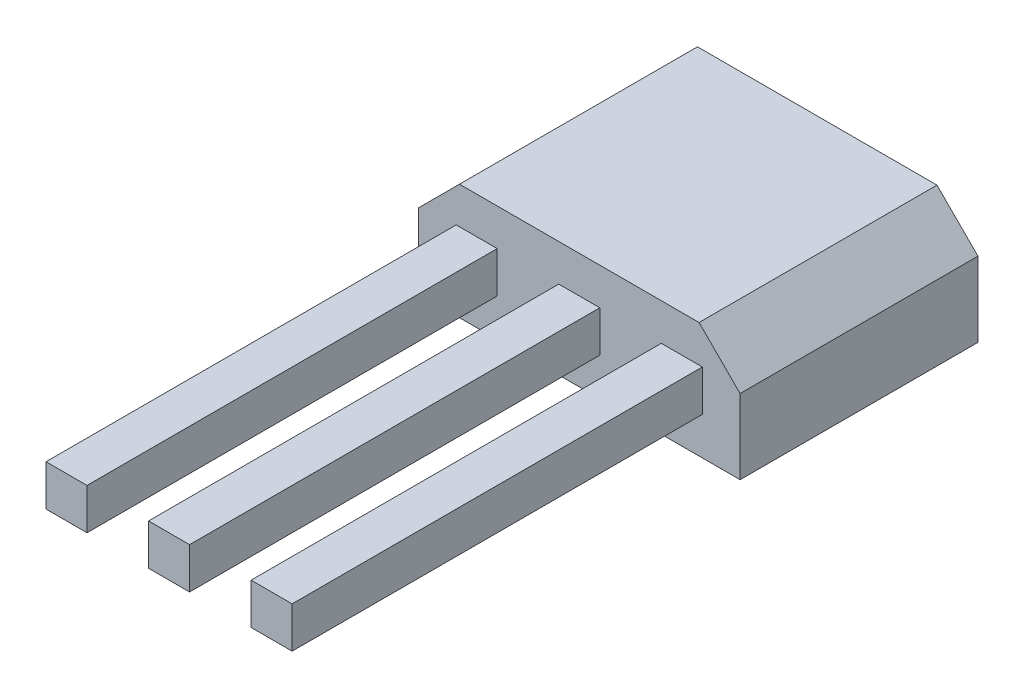
ISO-10303-21;
HEADER;
FILE_DESCRIPTION(('STEP AP214'),'2;1');
FILE_NAME('part.step','',(''),(''),'','','');
FILE_SCHEMA(('AUTOMOTIVE_DESIGN { 1 0 10303 214 1 1 1 1 }'));
ENDSEC;
DATA;
#1=APPLICATION_CONTEXT('core data for automotive mechanical design processes');
#2=APPLICATION_PROTOCOL_DEFINITION('international standard','automotive_design',2000,#1);
#3=PRODUCT_CONTEXT('',#1,'mechanical');
#4=PRODUCT('Part','Part','',(#3));
#5=PRODUCT_RELATED_PRODUCT_CATEGORY('part','',(#4));
#6=PRODUCT_DEFINITION_FORMATION('','',#4);
#7=PRODUCT_DEFINITION_CONTEXT('part definition',#1,'design');
#8=PRODUCT_DEFINITION('design','',#6,#7);
#9=PRODUCT_DEFINITION_SHAPE('','',#8);
#10=(LENGTH_UNIT() NAMED_UNIT(*) SI_UNIT(.MILLI.,.METRE.));
#11=(NAMED_UNIT(*) PLANE_ANGLE_UNIT() SI_UNIT($,.RADIAN.));
#12=(NAMED_UNIT(*) SI_UNIT($,.STERADIAN.) SOLID_ANGLE_UNIT());
#13=UNCERTAINTY_MEASURE_WITH_UNIT(LENGTH_MEASURE(1.E-05),#10,'distance_accuracy_value','');
#14=(GEOMETRIC_REPRESENTATION_CONTEXT(3) GLOBAL_UNCERTAINTY_ASSIGNED_CONTEXT((#13)) GLOBAL_UNIT_ASSIGNED_CONTEXT((#10,
#11,#12)) REPRESENTATION_CONTEXT('',''));
#15=CARTESIAN_POINT('',(0.,0.,0.));
#16=DIRECTION('',(0.,0.,1.));
#17=DIRECTION('',(1.,0.,0.));
#18=AXIS2_PLACEMENT_3D('',#15,#16,#17);
#19=CARTESIAN_POINT('',(0.,1.41,0.));
#20=DIRECTION('',(0.,0.,-1.));
#21=DIRECTION('',(-1.,0.,0.));
#22=AXIS2_PLACEMENT_3D('',#19,#20,#21);
#23=PLANE('',#22);
#24=DIRECTION('',(0.,-1.,0.));
#25=VECTOR('',#24,1.);
#26=CARTESIAN_POINT('',(1.71,0.96,0.));
#27=LINE('',#26,#25);
#28=CARTESIAN_POINT('',(1.71,0.96,0.));
#29=VERTEX_POINT('',#28);
#30=CARTESIAN_POINT('',(1.71,0.46,0.));
#31=VERTEX_POINT('',#30);
#32=EDGE_CURVE('E181',#29,#31,#27,.T.);
#33=ORIENTED_EDGE('',*,*,#32,.F.);
#34=DIRECTION('',(-1.,0.,0.));
#35=VECTOR('',#34,1.);
#36=CARTESIAN_POINT('',(1.71,0.96,0.));
#37=LINE('',#36,#35);
#38=CARTESIAN_POINT('',(2.21,0.96,0.));
#39=VERTEX_POINT('',#38);
#40=EDGE_CURVE('E194',#39,#29,#37,.T.);
#41=ORIENTED_EDGE('',*,*,#40,.F.);
#42=DIRECTION('',(0.,1.,0.));
#43=VECTOR('',#42,1.);
#44=CARTESIAN_POINT('',(2.21,0.96,0.));
#45=LINE('',#44,#43);
#46=CARTESIAN_POINT('',(2.21,0.46,0.));
#47=VERTEX_POINT('',#46);
#48=EDGE_CURVE('E203',#47,#39,#45,.T.);
#49=ORIENTED_EDGE('',*,*,#48,.F.);
#50=DIRECTION('',(1.,0.,0.));
#51=VECTOR('',#50,1.);
#52=CARTESIAN_POINT('',(1.71,0.46,0.));
#53=LINE('',#52,#51);
#54=EDGE_CURVE('E184',#31,#47,#53,.T.);
#55=ORIENTED_EDGE('',*,*,#54,.F.);
#56=EDGE_LOOP('',(#33,#41,#49,#55));
#57=FACE_BOUND('',#56,.T.);
#58=DIRECTION('',(1.,0.,0.));
#59=VECTOR('',#58,1.);
#60=CARTESIAN_POINT('',(0.,1.41,0.));
#61=LINE('',#60,#59);
#62=CARTESIAN_POINT('',(0.5,1.41,0.));
#63=VERTEX_POINT('',#62);
#64=CARTESIAN_POINT('',(3.42,1.41,0.));
#65=VERTEX_POINT('',#64);
#66=EDGE_CURVE('E253',#63,#65,#61,.T.);
#67=ORIENTED_EDGE('',*,*,#66,.F.);
#68=DIRECTION('',(0.707106781186547,0.707106781186549,0.));
#69=VECTOR('',#68,1.);
#70=CARTESIAN_POINT('',(0.5,1.41,0.));
#71=LINE('',#70,#69);
#72=CARTESIAN_POINT('',(0.,0.909999999999998,0.));
#73=VERTEX_POINT('',#72);
#74=EDGE_CURVE('E286',#63,#73,#71,.F.);
#75=ORIENTED_EDGE('',*,*,#74,.T.);
#76=DIRECTION('',(0.,-1.,0.));
#77=VECTOR('',#76,1.);
#78=CARTESIAN_POINT('',(0.,1.41,0.));
#79=LINE('',#78,#77);
#80=CARTESIAN_POINT('',(0.,0.,0.));
#81=VERTEX_POINT('',#80);
#82=EDGE_CURVE('E276',#73,#81,#79,.T.);
#83=ORIENTED_EDGE('',*,*,#82,.T.);
#84=DIRECTION('',(1.,0.,0.));
#85=VECTOR('',#84,1.);
#86=CARTESIAN_POINT('',(0.,0.,0.));
#87=LINE('',#86,#85);
#88=CARTESIAN_POINT('',(3.92,0.,0.));
#89=VERTEX_POINT('',#88);
#90=EDGE_CURVE('E263',#81,#89,#87,.T.);
#91=ORIENTED_EDGE('',*,*,#90,.T.);
#92=DIRECTION('',(0.,-1.,0.));
#93=VECTOR('',#92,1.);
#94=CARTESIAN_POINT('',(3.92,1.41,0.));
#95=LINE('',#94,#93);
#96=CARTESIAN_POINT('',(3.92,0.909999999999999,0.));
#97=VERTEX_POINT('',#96);
#98=EDGE_CURVE('E274',#97,#89,#95,.T.);
#99=ORIENTED_EDGE('',*,*,#98,.F.);
#100=DIRECTION('',(0.707106781186546,-0.707106781186549,0.));
#101=VECTOR('',#100,1.);
#102=CARTESIAN_POINT('',(3.42,1.41,0.));
#103=LINE('',#102,#101);
#104=EDGE_CURVE('E284',#97,#65,#103,.F.);
#105=ORIENTED_EDGE('',*,*,#104,.T.);
#106=EDGE_LOOP('',(#67,#75,#83,#91,#99,#105));
#107=FACE_BOUND('',#106,.T.);
#108=DIRECTION('',(0.,-1.,0.));
#109=VECTOR('',#108,1.);
#110=CARTESIAN_POINT('',(0.46,0.96,0.));
#111=LINE('',#110,#109);
#112=CARTESIAN_POINT('',(0.46,0.96,0.));
#113=VERTEX_POINT('',#112);
#114=CARTESIAN_POINT('',(0.46,0.46,0.));
#115=VERTEX_POINT('',#114);
#116=EDGE_CURVE('E219',#113,#115,#111,.T.);
#117=ORIENTED_EDGE('',*,*,#116,.F.);
#118=DIRECTION('',(-1.,0.,0.));
#119=VECTOR('',#118,1.);
#120=CARTESIAN_POINT('',(0.46,0.96,0.));
#121=LINE('',#120,#119);
#122=CARTESIAN_POINT('',(0.96,0.96,0.));
#123=VERTEX_POINT('',#122);
#124=EDGE_CURVE('E224',#123,#113,#121,.T.);
#125=ORIENTED_EDGE('',*,*,#124,.F.);
#126=DIRECTION('',(0.,1.,0.));
#127=VECTOR('',#126,1.);
#128=CARTESIAN_POINT('',(0.96,0.96,0.));
#129=LINE('',#128,#127);
#130=CARTESIAN_POINT('',(0.96,0.46,0.));
#131=VERTEX_POINT('',#130);
#132=EDGE_CURVE('E236',#131,#123,#129,.T.);
#133=ORIENTED_EDGE('',*,*,#132,.F.);
#134=DIRECTION('',(1.,0.,0.));
#135=VECTOR('',#134,1.);
#136=CARTESIAN_POINT('',(0.46,0.46,0.));
#137=LINE('',#136,#135);
#138=EDGE_CURVE('E233',#115,#131,#137,.T.);
#139=ORIENTED_EDGE('',*,*,#138,.F.);
#140=EDGE_LOOP('',(#117,#125,#133,#139));
#141=FACE_BOUND('',#140,.T.);
#142=DIRECTION('',(0.,-1.,0.));
#143=VECTOR('',#142,1.);
#144=CARTESIAN_POINT('',(2.96,0.960000000000002,0.));
#145=LINE('',#144,#143);
#146=CARTESIAN_POINT('',(2.96,0.960000000000002,0.));
#147=VERTEX_POINT('',#146);
#148=CARTESIAN_POINT('',(2.96,0.460000000000002,0.));
#149=VERTEX_POINT('',#148);
#150=EDGE_CURVE('E180',#147,#149,#145,.T.);
#151=ORIENTED_EDGE('',*,*,#150,.F.);
#152=DIRECTION('',(-1.,0.,0.));
#153=VECTOR('',#152,1.);
#154=CARTESIAN_POINT('',(2.96,0.960000000000002,0.));
#155=LINE('',#154,#153);
#156=CARTESIAN_POINT('',(3.46,0.960000000000002,0.));
#157=VERTEX_POINT('',#156);
#158=EDGE_CURVE('E177',#157,#147,#155,.T.);
#159=ORIENTED_EDGE('',*,*,#158,.F.);
#160=DIRECTION('',(0.,1.,0.));
#161=VECTOR('',#160,1.);
#162=CARTESIAN_POINT('',(3.46,0.960000000000002,0.));
#163=LINE('',#162,#161);
#164=CARTESIAN_POINT('',(3.46,0.460000000000002,0.));
#165=VERTEX_POINT('',#164);
#166=EDGE_CURVE('E56',#165,#157,#163,.T.);
#167=ORIENTED_EDGE('',*,*,#166,.F.);
#168=DIRECTION('',(1.,0.,0.));
#169=VECTOR('',#168,1.);
#170=CARTESIAN_POINT('',(2.96,0.460000000000002,0.));
#171=LINE('',#170,#169);
#172=EDGE_CURVE('E51',#149,#165,#171,.T.);
#173=ORIENTED_EDGE('',*,*,#172,.F.);
#174=EDGE_LOOP('',(#151,#159,#167,#173));
#175=FACE_BOUND('',#174,.T.);
#176=ADVANCED_FACE('F35',(#57,#107,#141,#175),#23,.F.);
#177=CARTESIAN_POINT('',(0.,1.41,0.));
#178=DIRECTION('',(1.,0.,0.));
#179=DIRECTION('',(0.,0.,-1.));
#180=AXIS2_PLACEMENT_3D('',#177,#178,#179);
#181=PLANE('',#180);
#182=ORIENTED_EDGE('',*,*,#82,.F.);
#183=DIRECTION('',(0.,0.,-1.));
#184=VECTOR('',#183,1.);
#185=CARTESIAN_POINT('',(0.,0.909999999999998,0.));
#186=LINE('',#185,#184);
#187=CARTESIAN_POINT('',(0.,0.909999999999998,-2.9));
#188=VERTEX_POINT('',#187);
#189=EDGE_CURVE('E288',#73,#188,#186,.T.);
#190=ORIENTED_EDGE('',*,*,#189,.T.);
#191=DIRECTION('',(0.,-1.,0.));
#192=VECTOR('',#191,1.);
#193=CARTESIAN_POINT('',(0.,1.41,-2.9));
#194=LINE('',#193,#192);
#195=CARTESIAN_POINT('',(0.,0.,-2.9));
#196=VERTEX_POINT('',#195);
#197=EDGE_CURVE('E260',#188,#196,#194,.T.);
#198=ORIENTED_EDGE('',*,*,#197,.T.);
#199=DIRECTION('',(0.,0.,1.));
#200=VECTOR('',#199,1.);
#201=CARTESIAN_POINT('',(0.,0.,0.));
#202=LINE('',#201,#200);
#203=EDGE_CURVE('E252',#196,#81,#202,.T.);
#204=ORIENTED_EDGE('',*,*,#203,.T.);
#205=EDGE_LOOP('',(#182,#190,#198,#204));
#206=FACE_BOUND('',#205,.T.);
#207=ADVANCED_FACE('F309',(#206),#181,.F.);
#208=CARTESIAN_POINT('',(3.92,1.41,0.));
#209=DIRECTION('',(-1.,0.,0.));
#210=DIRECTION('',(0.,0.,1.));
#211=AXIS2_PLACEMENT_3D('',#208,#209,#210);
#212=PLANE('',#211);
#213=DIRECTION('',(0.,-1.,0.));
#214=VECTOR('',#213,1.);
#215=CARTESIAN_POINT('',(3.92,1.41,-2.9));
#216=LINE('',#215,#214);
#217=CARTESIAN_POINT('',(3.92,0.909999999999999,-2.9));
#218=VERTEX_POINT('',#217);
#219=CARTESIAN_POINT('',(3.92,0.,-2.9));
#220=VERTEX_POINT('',#219);
#221=EDGE_CURVE('E272',#218,#220,#216,.T.);
#222=ORIENTED_EDGE('',*,*,#221,.F.);
#223=DIRECTION('',(0.,0.,1.));
#224=VECTOR('',#223,1.);
#225=CARTESIAN_POINT('',(3.92,0.909999999999999,0.));
#226=LINE('',#225,#224);
#227=EDGE_CURVE('E11',#218,#97,#226,.T.);
#228=ORIENTED_EDGE('',*,*,#227,.T.);
#229=ORIENTED_EDGE('',*,*,#98,.T.);
#230=DIRECTION('',(0.,0.,-1.));
#231=VECTOR('',#230,1.);
#232=CARTESIAN_POINT('',(3.92,0.,0.));
#233=LINE('',#232,#231);
#234=EDGE_CURVE('E266',#89,#220,#233,.T.);
#235=ORIENTED_EDGE('',*,*,#234,.T.);
#236=EDGE_LOOP('',(#222,#228,#229,#235));
#237=FACE_BOUND('',#236,.T.);
#238=ADVANCED_FACE('F321',(#237),#212,.F.);
#239=CARTESIAN_POINT('',(0.,1.41,-2.9));
#240=DIRECTION('',(0.,0.,1.));
#241=DIRECTION('',(1.,0.,0.));
#242=AXIS2_PLACEMENT_3D('',#239,#240,#241);
#243=PLANE('',#242);
#244=ORIENTED_EDGE('',*,*,#197,.F.);
#245=DIRECTION('',(-0.707106781186547,-0.707106781186549,0.));
#246=VECTOR('',#245,1.);
#247=CARTESIAN_POINT('',(0.5,1.41,-2.9));
#248=LINE('',#247,#246);
#249=CARTESIAN_POINT('',(0.5,1.41,-2.9));
#250=VERTEX_POINT('',#249);
#251=EDGE_CURVE('E44',#188,#250,#248,.F.);
#252=ORIENTED_EDGE('',*,*,#251,.T.);
#253=DIRECTION('',(-1.,0.,0.));
#254=VECTOR('',#253,1.);
#255=CARTESIAN_POINT('',(0.,1.41,-2.9));
#256=LINE('',#255,#254);
#257=CARTESIAN_POINT('',(3.42,1.41,-2.9));
#258=VERTEX_POINT('',#257);
#259=EDGE_CURVE('E256',#258,#250,#256,.T.);
#260=ORIENTED_EDGE('',*,*,#259,.F.);
#261=DIRECTION('',(-0.707106781186546,0.707106781186549,0.));
#262=VECTOR('',#261,1.);
#263=CARTESIAN_POINT('',(3.42,1.41,-2.9));
#264=LINE('',#263,#262);
#265=EDGE_CURVE('E290',#258,#218,#264,.F.);
#266=ORIENTED_EDGE('',*,*,#265,.T.);
#267=ORIENTED_EDGE('',*,*,#221,.T.);
#268=DIRECTION('',(-1.,0.,0.));
#269=VECTOR('',#268,1.);
#270=CARTESIAN_POINT('',(0.,0.,-2.9));
#271=LINE('',#270,#269);
#272=EDGE_CURVE('E257',#220,#196,#271,.T.);
#273=ORIENTED_EDGE('',*,*,#272,.T.);
#274=EDGE_LOOP('',(#244,#252,#260,#266,#267,#273));
#275=FACE_BOUND('',#274,.T.);
#276=ADVANCED_FACE('F295',(#275),#243,.F.);
#277=CARTESIAN_POINT('',(0.,1.41,0.));
#278=DIRECTION('',(0.,-1.,0.));
#279=DIRECTION('',(0.,0.,-1.));
#280=AXIS2_PLACEMENT_3D('',#277,#278,#279);
#281=PLANE('',#280);
#282=ORIENTED_EDGE('',*,*,#259,.T.);
#283=DIRECTION('',(0.,0.,1.));
#284=VECTOR('',#283,1.);
#285=CARTESIAN_POINT('',(0.5,1.41,0.));
#286=LINE('',#285,#284);
#287=EDGE_CURVE('E281',#250,#63,#286,.T.);
#288=ORIENTED_EDGE('',*,*,#287,.T.);
#289=ORIENTED_EDGE('',*,*,#66,.T.);
#290=DIRECTION('',(0.,0.,-1.));
#291=VECTOR('',#290,1.);
#292=CARTESIAN_POINT('',(3.42,1.41,0.));
#293=LINE('',#292,#291);
#294=EDGE_CURVE('E278',#65,#258,#293,.T.);
#295=ORIENTED_EDGE('',*,*,#294,.T.);
#296=EDGE_LOOP('',(#282,#288,#289,#295));
#297=FACE_BOUND('',#296,.T.);
#298=ADVANCED_FACE('F300',(#297),#281,.F.);
#299=CARTESIAN_POINT('',(0.,0.,0.));
#300=DIRECTION('',(0.,-1.,0.));
#301=DIRECTION('',(0.,0.,-1.));
#302=AXIS2_PLACEMENT_3D('',#299,#300,#301);
#303=PLANE('',#302);
#304=ORIENTED_EDGE('',*,*,#203,.F.);
#305=ORIENTED_EDGE('',*,*,#272,.F.);
#306=ORIENTED_EDGE('',*,*,#234,.F.);
#307=ORIENTED_EDGE('',*,*,#90,.F.);
#308=EDGE_LOOP('',(#304,#305,#306,#307));
#309=FACE_BOUND('',#308,.T.);
#310=ADVANCED_FACE('F313',(#309),#303,.T.);
#311=CARTESIAN_POINT('',(0.5,1.41,0.));
#312=DIRECTION('',(0.707106781186549,-0.707106781186547,0.));
#313=DIRECTION('',(0.,0.,1.));
#314=AXIS2_PLACEMENT_3D('',#311,#312,#313);
#315=PLANE('',#314);
#316=ORIENTED_EDGE('',*,*,#251,.F.);
#317=ORIENTED_EDGE('',*,*,#189,.F.);
#318=ORIENTED_EDGE('',*,*,#74,.F.);
#319=ORIENTED_EDGE('',*,*,#287,.F.);
#320=EDGE_LOOP('',(#316,#317,#318,#319));
#321=FACE_BOUND('',#320,.T.);
#322=ADVANCED_FACE('F303',(#321),#315,.F.);
#323=CARTESIAN_POINT('',(3.42,1.41,0.));
#324=DIRECTION('',(-0.707106781186549,-0.707106781186546,0.));
#325=DIRECTION('',(0.,0.,-1.));
#326=AXIS2_PLACEMENT_3D('',#323,#324,#325);
#327=PLANE('',#326);
#328=ORIENTED_EDGE('',*,*,#104,.F.);
#329=ORIENTED_EDGE('',*,*,#227,.F.);
#330=ORIENTED_EDGE('',*,*,#265,.F.);
#331=ORIENTED_EDGE('',*,*,#294,.F.);
#332=EDGE_LOOP('',(#328,#329,#330,#331));
#333=FACE_BOUND('',#332,.T.);
#334=ADVANCED_FACE('F38',(#333),#327,.F.);
#335=CARTESIAN_POINT('',(0.46,0.96,5.));
#336=DIRECTION('',(1.,0.,0.));
#337=DIRECTION('',(0.,1.,0.));
#338=AXIS2_PLACEMENT_3D('',#335,#336,#337);
#339=PLANE('',#338);
#340=ORIENTED_EDGE('',*,*,#116,.T.);
#341=DIRECTION('',(0.,0.,-1.));
#342=VECTOR('',#341,1.);
#343=CARTESIAN_POINT('',(0.46,0.46,5.));
#344=LINE('',#343,#342);
#345=CARTESIAN_POINT('',(0.46,0.46,5.));
#346=VERTEX_POINT('',#345);
#347=EDGE_CURVE('E249',#346,#115,#344,.T.);
#348=ORIENTED_EDGE('',*,*,#347,.F.);
#349=DIRECTION('',(0.,-1.,0.));
#350=VECTOR('',#349,1.);
#351=CARTESIAN_POINT('',(0.46,0.96,5.));
#352=LINE('',#351,#350);
#353=CARTESIAN_POINT('',(0.46,0.96,5.));
#354=VERTEX_POINT('',#353);
#355=EDGE_CURVE('E220',#354,#346,#352,.T.);
#356=ORIENTED_EDGE('',*,*,#355,.F.);
#357=DIRECTION('',(0.,0.,-1.));
#358=VECTOR('',#357,1.);
#359=CARTESIAN_POINT('',(0.46,0.96,5.));
#360=LINE('',#359,#358);
#361=EDGE_CURVE('E230',#354,#113,#360,.T.);
#362=ORIENTED_EDGE('',*,*,#361,.T.);
#363=EDGE_LOOP('',(#340,#348,#356,#362));
#364=FACE_BOUND('',#363,.T.);
#365=ADVANCED_FACE('F345',(#364),#339,.F.);
#366=CARTESIAN_POINT('',(0.46,0.46,5.));
#367=DIRECTION('',(0.,1.,0.));
#368=DIRECTION('',(-1.,0.,0.));
#369=AXIS2_PLACEMENT_3D('',#366,#367,#368);
#370=PLANE('',#369);
#371=ORIENTED_EDGE('',*,*,#138,.T.);
#372=DIRECTION('',(0.,0.,-1.));
#373=VECTOR('',#372,1.);
#374=CARTESIAN_POINT('',(0.96,0.46,5.));
#375=LINE('',#374,#373);
#376=CARTESIAN_POINT('',(0.96,0.46,5.));
#377=VERTEX_POINT('',#376);
#378=EDGE_CURVE('E246',#377,#131,#375,.T.);
#379=ORIENTED_EDGE('',*,*,#378,.F.);
#380=DIRECTION('',(1.,0.,0.));
#381=VECTOR('',#380,1.);
#382=CARTESIAN_POINT('',(0.46,0.46,5.));
#383=LINE('',#382,#381);
#384=EDGE_CURVE('E223',#346,#377,#383,.T.);
#385=ORIENTED_EDGE('',*,*,#384,.F.);
#386=ORIENTED_EDGE('',*,*,#347,.T.);
#387=EDGE_LOOP('',(#371,#379,#385,#386));
#388=FACE_BOUND('',#387,.T.);
#389=ADVANCED_FACE('F354',(#388),#370,.F.);
#390=CARTESIAN_POINT('',(0.96,0.96,5.));
#391=DIRECTION('',(-1.,0.,0.));
#392=DIRECTION('',(0.,-1.,0.));
#393=AXIS2_PLACEMENT_3D('',#390,#391,#392);
#394=PLANE('',#393);
#395=ORIENTED_EDGE('',*,*,#132,.T.);
#396=DIRECTION('',(0.,0.,-1.));
#397=VECTOR('',#396,1.);
#398=CARTESIAN_POINT('',(0.96,0.96,5.));
#399=LINE('',#398,#397);
#400=CARTESIAN_POINT('',(0.96,0.96,5.));
#401=VERTEX_POINT('',#400);
#402=EDGE_CURVE('E243',#401,#123,#399,.T.);
#403=ORIENTED_EDGE('',*,*,#402,.F.);
#404=DIRECTION('',(0.,1.,0.));
#405=VECTOR('',#404,1.);
#406=CARTESIAN_POINT('',(0.96,0.96,5.));
#407=LINE('',#406,#405);
#408=EDGE_CURVE('E226',#377,#401,#407,.T.);
#409=ORIENTED_EDGE('',*,*,#408,.F.);
#410=ORIENTED_EDGE('',*,*,#378,.T.);
#411=EDGE_LOOP('',(#395,#403,#409,#410));
#412=FACE_BOUND('',#411,.T.);
#413=ADVANCED_FACE('F358',(#412),#394,.F.);
#414=CARTESIAN_POINT('',(0.46,0.96,5.));
#415=DIRECTION('',(0.,-1.,0.));
#416=DIRECTION('',(1.,0.,0.));
#417=AXIS2_PLACEMENT_3D('',#414,#415,#416);
#418=PLANE('',#417);
#419=ORIENTED_EDGE('',*,*,#124,.T.);
#420=ORIENTED_EDGE('',*,*,#361,.F.);
#421=DIRECTION('',(-1.,0.,0.));
#422=VECTOR('',#421,1.);
#423=CARTESIAN_POINT('',(0.46,0.96,5.));
#424=LINE('',#423,#422);
#425=EDGE_CURVE('E228',#401,#354,#424,.T.);
#426=ORIENTED_EDGE('',*,*,#425,.F.);
#427=ORIENTED_EDGE('',*,*,#402,.T.);
#428=EDGE_LOOP('',(#419,#420,#426,#427));
#429=FACE_BOUND('',#428,.T.);
#430=ADVANCED_FACE('F362',(#429),#418,.F.);
#431=CARTESIAN_POINT('',(0.,0.,5.));
#432=DIRECTION('',(0.,0.,1.));
#433=DIRECTION('',(1.,0.,0.));
#434=AXIS2_PLACEMENT_3D('',#431,#432,#433);
#435=PLANE('',#434);
#436=ORIENTED_EDGE('',*,*,#355,.T.);
#437=ORIENTED_EDGE('',*,*,#384,.T.);
#438=ORIENTED_EDGE('',*,*,#408,.T.);
#439=ORIENTED_EDGE('',*,*,#425,.T.);
#440=EDGE_LOOP('',(#436,#437,#438,#439));
#441=FACE_BOUND('',#440,.T.);
#442=ADVANCED_FACE('F366',(#441),#435,.T.);
#443=CARTESIAN_POINT('',(1.71,0.96,5.));
#444=DIRECTION('',(1.,0.,0.));
#445=DIRECTION('',(0.,1.,0.));
#446=AXIS2_PLACEMENT_3D('',#443,#444,#445);
#447=PLANE('',#446);
#448=ORIENTED_EDGE('',*,*,#32,.T.);
#449=DIRECTION('',(0.,0.,-1.));
#450=VECTOR('',#449,1.);
#451=CARTESIAN_POINT('',(1.71,0.46,5.));
#452=LINE('',#451,#450);
#453=CARTESIAN_POINT('',(1.71,0.46,5.));
#454=VERTEX_POINT('',#453);
#455=EDGE_CURVE('E216',#454,#31,#452,.T.);
#456=ORIENTED_EDGE('',*,*,#455,.F.);
#457=DIRECTION('',(0.,-1.,0.));
#458=VECTOR('',#457,1.);
#459=CARTESIAN_POINT('',(1.71,0.96,5.));
#460=LINE('',#459,#458);
#461=CARTESIAN_POINT('',(1.71,0.96,5.));
#462=VERTEX_POINT('',#461);
#463=EDGE_CURVE('E190',#462,#454,#460,.T.);
#464=ORIENTED_EDGE('',*,*,#463,.F.);
#465=DIRECTION('',(0.,0.,-1.));
#466=VECTOR('',#465,1.);
#467=CARTESIAN_POINT('',(1.71,0.96,5.));
#468=LINE('',#467,#466);
#469=EDGE_CURVE('E199',#462,#29,#468,.T.);
#470=ORIENTED_EDGE('',*,*,#469,.T.);
#471=EDGE_LOOP('',(#448,#456,#464,#470));
#472=FACE_BOUND('',#471,.T.);
#473=ADVANCED_FACE('F370',(#472),#447,.F.);
#474=CARTESIAN_POINT('',(1.71,0.46,5.));
#475=DIRECTION('',(0.,1.,0.));
#476=DIRECTION('',(0.,0.,1.));
#477=AXIS2_PLACEMENT_3D('',#474,#475,#476);
#478=PLANE('',#477);
#479=ORIENTED_EDGE('',*,*,#54,.T.);
#480=DIRECTION('',(0.,0.,-1.));
#481=VECTOR('',#480,1.);
#482=CARTESIAN_POINT('',(2.21,0.46,5.));
#483=LINE('',#482,#481);
#484=CARTESIAN_POINT('',(2.21,0.46,5.));
#485=VERTEX_POINT('',#484);
#486=EDGE_CURVE('E213',#485,#47,#483,.T.);
#487=ORIENTED_EDGE('',*,*,#486,.F.);
#488=DIRECTION('',(1.,0.,0.));
#489=VECTOR('',#488,1.);
#490=CARTESIAN_POINT('',(1.71,0.46,5.));
#491=LINE('',#490,#489);
#492=EDGE_CURVE('E193',#454,#485,#491,.T.);
#493=ORIENTED_EDGE('',*,*,#492,.F.);
#494=ORIENTED_EDGE('',*,*,#455,.T.);
#495=EDGE_LOOP('',(#479,#487,#493,#494));
#496=FACE_BOUND('',#495,.T.);
#497=ADVANCED_FACE('F374',(#496),#478,.F.);
#498=CARTESIAN_POINT('',(2.21,0.96,5.));
#499=DIRECTION('',(-1.,0.,0.));
#500=DIRECTION('',(0.,0.,1.));
#501=AXIS2_PLACEMENT_3D('',#498,#499,#500);
#502=PLANE('',#501);
#503=ORIENTED_EDGE('',*,*,#48,.T.);
#504=DIRECTION('',(0.,0.,-1.));
#505=VECTOR('',#504,1.);
#506=CARTESIAN_POINT('',(2.21,0.96,5.));
#507=LINE('',#506,#505);
#508=CARTESIAN_POINT('',(2.21,0.96,5.));
#509=VERTEX_POINT('',#508);
#510=EDGE_CURVE('E210',#509,#39,#507,.T.);
#511=ORIENTED_EDGE('',*,*,#510,.F.);
#512=DIRECTION('',(0.,1.,0.));
#513=VECTOR('',#512,1.);
#514=CARTESIAN_POINT('',(2.21,0.96,5.));
#515=LINE('',#514,#513);
#516=EDGE_CURVE('E196',#485,#509,#515,.T.);
#517=ORIENTED_EDGE('',*,*,#516,.F.);
#518=ORIENTED_EDGE('',*,*,#486,.T.);
#519=EDGE_LOOP('',(#503,#511,#517,#518));
#520=FACE_BOUND('',#519,.T.);
#521=ADVANCED_FACE('F378',(#520),#502,.F.);
#522=CARTESIAN_POINT('',(1.71,0.96,5.));
#523=DIRECTION('',(0.,-1.,0.));
#524=DIRECTION('',(1.,0.,0.));
#525=AXIS2_PLACEMENT_3D('',#522,#523,#524);
#526=PLANE('',#525);
#527=ORIENTED_EDGE('',*,*,#40,.T.);
#528=ORIENTED_EDGE('',*,*,#469,.F.);
#529=DIRECTION('',(-1.,0.,0.));
#530=VECTOR('',#529,1.);
#531=CARTESIAN_POINT('',(1.71,0.96,5.));
#532=LINE('',#531,#530);
#533=EDGE_CURVE('E198',#509,#462,#532,.T.);
#534=ORIENTED_EDGE('',*,*,#533,.F.);
#535=ORIENTED_EDGE('',*,*,#510,.T.);
#536=EDGE_LOOP('',(#527,#528,#534,#535));
#537=FACE_BOUND('',#536,.T.);
#538=ADVANCED_FACE('F382',(#537),#526,.F.);
#539=CARTESIAN_POINT('',(0.,0.,5.));
#540=DIRECTION('',(0.,0.,1.));
#541=DIRECTION('',(1.,0.,0.));
#542=AXIS2_PLACEMENT_3D('',#539,#540,#541);
#543=PLANE('',#542);
#544=ORIENTED_EDGE('',*,*,#463,.T.);
#545=ORIENTED_EDGE('',*,*,#492,.T.);
#546=ORIENTED_EDGE('',*,*,#516,.T.);
#547=ORIENTED_EDGE('',*,*,#533,.T.);
#548=EDGE_LOOP('',(#544,#545,#546,#547));
#549=FACE_BOUND('',#548,.T.);
#550=ADVANCED_FACE('F386',(#549),#543,.T.);
#551=CARTESIAN_POINT('',(2.96,0.960000000000002,5.));
#552=DIRECTION('',(1.,0.,0.));
#553=DIRECTION('',(0.,0.,-1.));
#554=AXIS2_PLACEMENT_3D('',#551,#552,#553);
#555=PLANE('',#554);
#556=ORIENTED_EDGE('',*,*,#150,.T.);
#557=DIRECTION('',(0.,0.,-1.));
#558=VECTOR('',#557,1.);
#559=CARTESIAN_POINT('',(2.96,0.460000000000002,5.));
#560=LINE('',#559,#558);
#561=CARTESIAN_POINT('',(2.96,0.460000000000002,5.));
#562=VERTEX_POINT('',#561);
#563=EDGE_CURVE('E161',#562,#149,#560,.T.);
#564=ORIENTED_EDGE('',*,*,#563,.F.);
#565=DIRECTION('',(0.,-1.,0.));
#566=VECTOR('',#565,1.);
#567=CARTESIAN_POINT('',(2.96,0.960000000000002,5.));
#568=LINE('',#567,#566);
#569=CARTESIAN_POINT('',(2.96,0.960000000000002,5.));
#570=VERTEX_POINT('',#569);
#571=EDGE_CURVE('E168',#570,#562,#568,.T.);
#572=ORIENTED_EDGE('',*,*,#571,.F.);
#573=DIRECTION('',(0.,0.,-1.));
#574=VECTOR('',#573,1.);
#575=CARTESIAN_POINT('',(2.96,0.960000000000002,5.));
#576=LINE('',#575,#574);
#577=EDGE_CURVE('E534',#570,#147,#576,.T.);
#578=ORIENTED_EDGE('',*,*,#577,.T.);
#579=EDGE_LOOP('',(#556,#564,#572,#578));
#580=FACE_BOUND('',#579,.T.);
#581=ADVANCED_FACE('F179',(#580),#555,.F.);
#582=CARTESIAN_POINT('',(2.96,0.460000000000002,5.));
#583=DIRECTION('',(0.,1.,0.));
#584=DIRECTION('',(0.,0.,1.));
#585=AXIS2_PLACEMENT_3D('',#582,#583,#584);
#586=PLANE('',#585);
#587=ORIENTED_EDGE('',*,*,#172,.T.);
#588=DIRECTION('',(0.,0.,-1.));
#589=VECTOR('',#588,1.);
#590=CARTESIAN_POINT('',(3.46,0.460000000000002,5.));
#591=LINE('',#590,#589);
#592=CARTESIAN_POINT('',(3.46,0.460000000000002,5.));
#593=VERTEX_POINT('',#592);
#594=EDGE_CURVE('E164',#593,#165,#591,.T.);
#595=ORIENTED_EDGE('',*,*,#594,.F.);
#596=DIRECTION('',(1.,0.,0.));
#597=VECTOR('',#596,1.);
#598=CARTESIAN_POINT('',(2.96,0.460000000000002,5.));
#599=LINE('',#598,#597);
#600=EDGE_CURVE('E157',#562,#593,#599,.T.);
#601=ORIENTED_EDGE('',*,*,#600,.F.);
#602=ORIENTED_EDGE('',*,*,#563,.T.);
#603=EDGE_LOOP('',(#587,#595,#601,#602));
#604=FACE_BOUND('',#603,.T.);
#605=ADVANCED_FACE('F159',(#604),#586,.F.);
#606=CARTESIAN_POINT('',(3.46,0.960000000000002,5.));
#607=DIRECTION('',(-1.,0.,0.));
#608=DIRECTION('',(0.,-1.,0.));
#609=AXIS2_PLACEMENT_3D('',#606,#607,#608);
#610=PLANE('',#609);
#611=ORIENTED_EDGE('',*,*,#166,.T.);
#612=DIRECTION('',(0.,0.,-1.));
#613=VECTOR('',#612,1.);
#614=CARTESIAN_POINT('',(3.46,0.960000000000002,5.));
#615=LINE('',#614,#613);
#616=CARTESIAN_POINT('',(3.46,0.960000000000002,5.));
#617=VERTEX_POINT('',#616);
#618=EDGE_CURVE('E186',#617,#157,#615,.T.);
#619=ORIENTED_EDGE('',*,*,#618,.F.);
#620=DIRECTION('',(0.,1.,0.));
#621=VECTOR('',#620,1.);
#622=CARTESIAN_POINT('',(3.46,0.960000000000002,5.));
#623=LINE('',#622,#621);
#624=EDGE_CURVE('E167',#593,#617,#623,.T.);
#625=ORIENTED_EDGE('',*,*,#624,.F.);
#626=ORIENTED_EDGE('',*,*,#594,.T.);
#627=EDGE_LOOP('',(#611,#619,#625,#626));
#628=FACE_BOUND('',#627,.T.);
#629=ADVANCED_FACE('F395',(#628),#610,.F.);
#630=CARTESIAN_POINT('',(2.96,0.960000000000002,5.));
#631=DIRECTION('',(0.,-1.,0.));
#632=DIRECTION('',(0.,0.,-1.));
#633=AXIS2_PLACEMENT_3D('',#630,#631,#632);
#634=PLANE('',#633);
#635=ORIENTED_EDGE('',*,*,#158,.T.);
#636=ORIENTED_EDGE('',*,*,#577,.F.);
#637=DIRECTION('',(-1.,0.,0.));
#638=VECTOR('',#637,1.);
#639=CARTESIAN_POINT('',(2.96,0.960000000000002,5.));
#640=LINE('',#639,#638);
#641=EDGE_CURVE('E173',#617,#570,#640,.T.);
#642=ORIENTED_EDGE('',*,*,#641,.F.);
#643=ORIENTED_EDGE('',*,*,#618,.T.);
#644=EDGE_LOOP('',(#635,#636,#642,#643));
#645=FACE_BOUND('',#644,.T.);
#646=ADVANCED_FACE('F398',(#645),#634,.F.);
#647=CARTESIAN_POINT('',(0.,0.,5.));
#648=DIRECTION('',(0.,0.,1.));
#649=DIRECTION('',(1.,0.,0.));
#650=AXIS2_PLACEMENT_3D('',#647,#648,#649);
#651=PLANE('',#650);
#652=ORIENTED_EDGE('',*,*,#571,.T.);
#653=ORIENTED_EDGE('',*,*,#600,.T.);
#654=ORIENTED_EDGE('',*,*,#624,.T.);
#655=ORIENTED_EDGE('',*,*,#641,.T.);
#656=EDGE_LOOP('',(#652,#653,#654,#655));
#657=FACE_BOUND('',#656,.T.);
#658=ADVANCED_FACE('F171',(#657),#651,.T.);
#659=CLOSED_SHELL('',(#176,#207,#238,#276,#298,#310,#322,#334,#365,#389,#413,#430,#442,#473,
#497,#521,#538,#550,#581,#605,#629,#646,#658));
#660=MANIFOLD_SOLID_BREP('B2',#659);
#661=ADVANCED_BREP_SHAPE_REPRESENTATION('',(#18,#660),#14);
#662=SHAPE_DEFINITION_REPRESENTATION(#9,#661);
ENDSEC;
END-ISO-10303-21;
